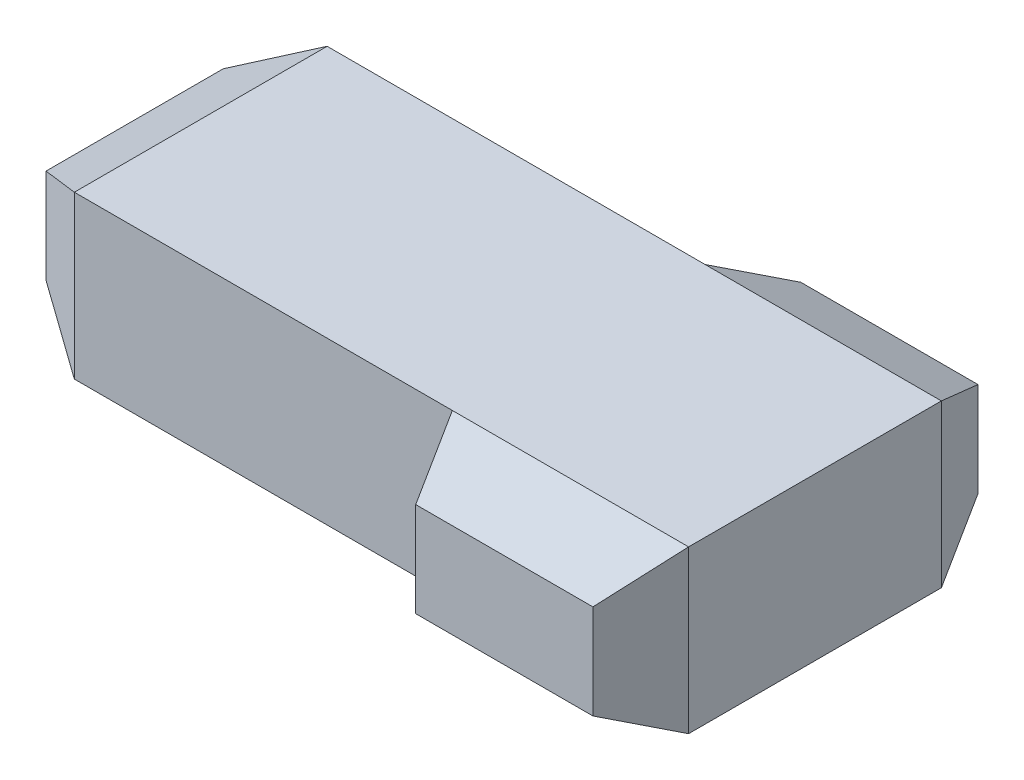
ISO-10303-21;
HEADER;
FILE_DESCRIPTION(('STEP AP214'),'2;1');
FILE_NAME('part.step','',(''),(''),'','','');
FILE_SCHEMA(('AUTOMOTIVE_DESIGN { 1 0 10303 214 1 1 1 1 }'));
ENDSEC;
DATA;
#1=APPLICATION_CONTEXT('core data for automotive mechanical design processes');
#2=APPLICATION_PROTOCOL_DEFINITION('international standard','automotive_design',2000,#1);
#3=PRODUCT_CONTEXT('',#1,'mechanical');
#4=PRODUCT('Part','Part','',(#3));
#5=PRODUCT_RELATED_PRODUCT_CATEGORY('part','',(#4));
#6=PRODUCT_DEFINITION_FORMATION('','',#4);
#7=PRODUCT_DEFINITION_CONTEXT('part definition',#1,'design');
#8=PRODUCT_DEFINITION('design','',#6,#7);
#9=PRODUCT_DEFINITION_SHAPE('','',#8);
#10=(LENGTH_UNIT() NAMED_UNIT(*) SI_UNIT(.MILLI.,.METRE.));
#11=(NAMED_UNIT(*) PLANE_ANGLE_UNIT() SI_UNIT($,.RADIAN.));
#12=(NAMED_UNIT(*) SI_UNIT($,.STERADIAN.) SOLID_ANGLE_UNIT());
#13=UNCERTAINTY_MEASURE_WITH_UNIT(LENGTH_MEASURE(1.E-05),#10,'distance_accuracy_value','');
#14=(GEOMETRIC_REPRESENTATION_CONTEXT(3) GLOBAL_UNCERTAINTY_ASSIGNED_CONTEXT((#13)) GLOBAL_UNIT_ASSIGNED_CONTEXT((#10,
#11,#12)) REPRESENTATION_CONTEXT('',''));
#15=CARTESIAN_POINT('',(0.,0.,0.));
#16=DIRECTION('',(0.,0.,1.));
#17=DIRECTION('',(1.,0.,0.));
#18=AXIS2_PLACEMENT_3D('',#15,#16,#17);
#19=CARTESIAN_POINT('',(13.,6.85,5.35));
#20=DIRECTION('',(0.,0.,-1.));
#21=DIRECTION('',(-1.,0.,0.));
#22=AXIS2_PLACEMENT_3D('',#19,#20,#21);
#23=PLANE('',#22);
#24=DIRECTION('',(1.,0.,0.));
#25=VECTOR('',#24,1.);
#26=CARTESIAN_POINT('',(13.,0.,5.35));
#27=LINE('',#26,#25);
#28=CARTESIAN_POINT('',(-13.,0.,5.35));
#29=VERTEX_POINT('',#28);
#30=CARTESIAN_POINT('',(2.99999999999999,0.,5.35));
#31=VERTEX_POINT('',#30);
#32=EDGE_CURVE('E273',#29,#31,#27,.T.);
#33=ORIENTED_EDGE('',*,*,#32,.T.);
#34=DIRECTION('',(0.,-1.,0.));
#35=VECTOR('',#34,1.);
#36=CARTESIAN_POINT('',(2.99999999999999,6.85,5.35));
#37=LINE('',#36,#35);
#38=CARTESIAN_POINT('',(3.,6.85,5.35));
#39=VERTEX_POINT('',#38);
#40=EDGE_CURVE('E285',#39,#31,#37,.T.);
#41=ORIENTED_EDGE('',*,*,#40,.F.);
#42=DIRECTION('',(1.,0.,0.));
#43=VECTOR('',#42,1.);
#44=CARTESIAN_POINT('',(13.,6.85,5.35));
#45=LINE('',#44,#43);
#46=CARTESIAN_POINT('',(-13.,6.85,5.35));
#47=VERTEX_POINT('',#46);
#48=EDGE_CURVE('E215',#47,#39,#45,.T.);
#49=ORIENTED_EDGE('',*,*,#48,.F.);
#50=DIRECTION('',(0.,1.,0.));
#51=VECTOR('',#50,1.);
#52=CARTESIAN_POINT('',(-13.,6.85,5.35));
#53=LINE('',#52,#51);
#54=EDGE_CURVE('E12',#47,#29,#53,.F.);
#55=ORIENTED_EDGE('',*,*,#54,.T.);
#56=EDGE_LOOP('',(#33,#41,#49,#55));
#57=FACE_BOUND('',#56,.T.);
#58=ADVANCED_FACE('F86',(#57),#23,.F.);
#59=CARTESIAN_POINT('',(13.,6.85,5.35));
#60=DIRECTION('',(-1.,0.,0.));
#61=DIRECTION('',(0.,0.,1.));
#62=AXIS2_PLACEMENT_3D('',#59,#60,#61);
#63=PLANE('',#62);
#64=DIRECTION('',(0.,0.,-1.));
#65=VECTOR('',#64,1.);
#66=CARTESIAN_POINT('',(13.,0.,5.35));
#67=LINE('',#66,#65);
#68=CARTESIAN_POINT('',(13.,0.,5.35));
#69=VERTEX_POINT('',#68);
#70=CARTESIAN_POINT('',(13.,0.,-5.35));
#71=VERTEX_POINT('',#70);
#72=EDGE_CURVE('E220',#69,#71,#67,.T.);
#73=ORIENTED_EDGE('',*,*,#72,.T.);
#74=CARTESIAN_POINT('',(13.,6.85,-5.35));
#75=DIRECTION('',(0.,-1.,0.));
#76=VECTOR('',#75,1.);
#77=LINE('',#74,#76);
#78=CARTESIAN_POINT('',(13.,6.85,-5.35));
#79=VERTEX_POINT('',#78);
#80=EDGE_CURVE('E185',#79,#71,#77,.T.);
#81=ORIENTED_EDGE('',*,*,#80,.F.);
#82=DIRECTION('',(0.,0.,-1.));
#83=VECTOR('',#82,1.);
#84=CARTESIAN_POINT('',(13.,6.85,5.35));
#85=LINE('',#84,#83);
#86=CARTESIAN_POINT('',(13.,6.85,5.35));
#87=VERTEX_POINT('',#86);
#88=EDGE_CURVE('E209',#87,#79,#85,.T.);
#89=ORIENTED_EDGE('',*,*,#88,.F.);
#90=DIRECTION('',(0.,1.,0.));
#91=VECTOR('',#90,1.);
#92=CARTESIAN_POINT('',(13.,6.85,5.35));
#93=LINE('',#92,#91);
#94=EDGE_CURVE('E96',#87,#69,#93,.F.);
#95=ORIENTED_EDGE('',*,*,#94,.T.);
#96=EDGE_LOOP('',(#73,#81,#89,#95));
#97=FACE_BOUND('',#96,.T.);
#98=ADVANCED_FACE('F218',(#97),#63,.F.);
#99=CARTESIAN_POINT('',(13.,6.85,-5.35));
#100=DIRECTION('',(0.,0.,1.));
#101=DIRECTION('',(1.,0.,0.));
#102=AXIS2_PLACEMENT_3D('',#99,#100,#101);
#103=PLANE('',#102);
#104=DIRECTION('',(-1.,0.,0.));
#105=VECTOR('',#104,1.);
#106=CARTESIAN_POINT('',(13.,6.85,-5.35));
#107=LINE('',#106,#105);
#108=CARTESIAN_POINT('',(2.99999999999999,6.85,-5.35));
#109=VERTEX_POINT('',#108);
#110=CARTESIAN_POINT('',(-13.,6.85,-5.35));
#111=VERTEX_POINT('',#110);
#112=EDGE_CURVE('E206',#109,#111,#107,.T.);
#113=ORIENTED_EDGE('',*,*,#112,.F.);
#114=CARTESIAN_POINT('',(2.99999999999999,6.85,-5.35));
#115=DIRECTION('',(0.,-1.,0.));
#116=VECTOR('',#115,1.);
#117=LINE('',#114,#116);
#118=CARTESIAN_POINT('',(3.,0.,-5.35));
#119=VERTEX_POINT('',#118);
#120=EDGE_CURVE('E254',#109,#119,#117,.T.);
#121=ORIENTED_EDGE('',*,*,#120,.T.);
#122=DIRECTION('',(-1.,0.,0.));
#123=VECTOR('',#122,1.);
#124=CARTESIAN_POINT('',(13.,0.,-5.35));
#125=LINE('',#124,#123);
#126=CARTESIAN_POINT('',(-13.,0.,-5.35));
#127=VERTEX_POINT('',#126);
#128=EDGE_CURVE('E258',#119,#127,#125,.T.);
#129=ORIENTED_EDGE('',*,*,#128,.T.);
#130=DIRECTION('',(0.,1.,0.));
#131=VECTOR('',#130,1.);
#132=CARTESIAN_POINT('',(-13.,0.,-5.35));
#133=LINE('',#132,#131);
#134=EDGE_CURVE('E205',#111,#127,#133,.F.);
#135=ORIENTED_EDGE('',*,*,#134,.F.);
#136=EDGE_LOOP('',(#113,#121,#129,#135));
#137=FACE_BOUND('',#136,.T.);
#138=ADVANCED_FACE('F236',(#137),#103,.F.);
#139=CARTESIAN_POINT('',(0.,6.85,0.));
#140=DIRECTION('',(0.,1.,0.));
#141=DIRECTION('',(0.,0.,1.));
#142=AXIS2_PLACEMENT_3D('',#139,#140,#141);
#143=PLANE('',#142);
#144=DIRECTION('',(0.,0.,1.));
#145=VECTOR('',#144,1.);
#146=CARTESIAN_POINT('',(-13.,6.85,0.));
#147=LINE('',#146,#145);
#148=EDGE_CURVE('E272',#111,#47,#147,.T.);
#149=ORIENTED_EDGE('',*,*,#148,.T.);
#150=ORIENTED_EDGE('',*,*,#48,.T.);
#151=DIRECTION('',(-1.,0.,0.));
#152=VECTOR('',#151,1.);
#153=CARTESIAN_POINT('',(13.,6.85,5.35));
#154=LINE('',#153,#152);
#155=EDGE_CURVE('E113',#87,#39,#154,.T.);
#156=ORIENTED_EDGE('',*,*,#155,.F.);
#157=ORIENTED_EDGE('',*,*,#88,.T.);
#158=CARTESIAN_POINT('',(13.,6.85,-5.35));
#159=DIRECTION('',(-1.,0.,0.));
#160=VECTOR('',#159,1.);
#161=LINE('',#158,#160);
#162=EDGE_CURVE('E197',#79,#109,#161,.T.);
#163=ORIENTED_EDGE('',*,*,#162,.T.);
#164=ORIENTED_EDGE('',*,*,#112,.T.);
#165=EDGE_LOOP('',(#149,#150,#156,#157,#163,#164));
#166=FACE_BOUND('',#165,.T.);
#167=ADVANCED_FACE('F211',(#166),#143,.T.);
#168=CARTESIAN_POINT('',(0.,0.,0.));
#169=DIRECTION('',(0.,1.,0.));
#170=DIRECTION('',(0.,0.,1.));
#171=AXIS2_PLACEMENT_3D('',#168,#169,#170);
#172=PLANE('',#171);
#173=DIRECTION('',(0.,0.,1.));
#174=VECTOR('',#173,1.);
#175=CARTESIAN_POINT('',(-13.,0.,0.));
#176=LINE('',#175,#174);
#177=EDGE_CURVE('E456',#127,#29,#176,.T.);
#178=ORIENTED_EDGE('',*,*,#177,.F.);
#179=ORIENTED_EDGE('',*,*,#128,.F.);
#180=CARTESIAN_POINT('',(13.,0.,-5.35));
#181=DIRECTION('',(-1.,0.,0.));
#182=VECTOR('',#181,1.);
#183=LINE('',#180,#182);
#184=EDGE_CURVE('E104',#71,#119,#183,.T.);
#185=ORIENTED_EDGE('',*,*,#184,.F.);
#186=ORIENTED_EDGE('',*,*,#72,.F.);
#187=DIRECTION('',(1.,0.,0.));
#188=VECTOR('',#187,1.);
#189=CARTESIAN_POINT('',(13.,0.,5.35));
#190=LINE('',#189,#188);
#191=EDGE_CURVE('E283',#31,#69,#190,.T.);
#192=ORIENTED_EDGE('',*,*,#191,.F.);
#193=ORIENTED_EDGE('',*,*,#32,.F.);
#194=EDGE_LOOP('',(#178,#179,#185,#186,#192,#193));
#195=FACE_BOUND('',#194,.T.);
#196=ADVANCED_FACE('F240',(#195),#172,.F.);
#197=CARTESIAN_POINT('',(-15.8,0.,0.));
#198=DIRECTION('',(-1.,0.,0.));
#199=DIRECTION('',(0.,0.,1.));
#200=AXIS2_PLACEMENT_3D('',#197,#198,#199);
#201=PLANE('',#200);
#202=DIRECTION('',(0.,-1.,0.));
#203=VECTOR('',#202,1.);
#204=CARTESIAN_POINT('',(-15.8,1.425,-3.75));
#205=LINE('',#204,#203);
#206=CARTESIAN_POINT('',(-15.8,5.425,-3.75));
#207=VERTEX_POINT('',#206);
#208=CARTESIAN_POINT('',(-15.8,1.425,-3.75));
#209=VERTEX_POINT('',#208);
#210=EDGE_CURVE('E433',#207,#209,#205,.T.);
#211=ORIENTED_EDGE('',*,*,#210,.T.);
#212=DIRECTION('',(0.,0.,1.));
#213=VECTOR('',#212,1.);
#214=CARTESIAN_POINT('',(-15.8,1.425,3.75));
#215=LINE('',#214,#213);
#216=CARTESIAN_POINT('',(-15.8,1.425,3.75));
#217=VERTEX_POINT('',#216);
#218=EDGE_CURVE('E476',#209,#217,#215,.T.);
#219=ORIENTED_EDGE('',*,*,#218,.T.);
#220=DIRECTION('',(0.,1.,0.));
#221=VECTOR('',#220,1.);
#222=CARTESIAN_POINT('',(-15.8,1.425,3.75));
#223=LINE('',#222,#221);
#224=CARTESIAN_POINT('',(-15.8,5.425,3.75));
#225=VERTEX_POINT('',#224);
#226=EDGE_CURVE('E483',#217,#225,#223,.T.);
#227=ORIENTED_EDGE('',*,*,#226,.T.);
#228=DIRECTION('',(0.,0.,-1.));
#229=VECTOR('',#228,1.);
#230=CARTESIAN_POINT('',(-15.8,5.425,3.75));
#231=LINE('',#230,#229);
#232=EDGE_CURVE('E490',#225,#207,#231,.T.);
#233=ORIENTED_EDGE('',*,*,#232,.T.);
#234=EDGE_LOOP('',(#211,#219,#227,#233));
#235=FACE_BOUND('',#234,.T.);
#236=ADVANCED_FACE('F488',(#235),#201,.T.);
#237=CARTESIAN_POINT('',(-5.44338631039067,10.6957766098905,0.));
#238=DIRECTION('',(0.453568137065489,-0.891221602654997,0.));
#239=DIRECTION('',(0.891221602654997,0.453568137065489,0.));
#240=AXIS2_PLACEMENT_3D('',#237,#238,#239);
#241=PLANE('',#240);
#242=DIRECTION('',(0.794166473196064,0.40417400868014,0.453809413254894));
#243=VECTOR('',#242,1.);
#244=CARTESIAN_POINT('',(-15.8,5.425,3.75));
#245=LINE('',#244,#243);
#246=EDGE_CURVE('E482',#225,#47,#245,.T.);
#247=ORIENTED_EDGE('',*,*,#246,.T.);
#248=ORIENTED_EDGE('',*,*,#148,.F.);
#249=DIRECTION('',(0.794166473196064,0.40417400868014,-0.453809413254894));
#250=VECTOR('',#249,1.);
#251=CARTESIAN_POINT('',(-15.8,5.425,-3.75));
#252=LINE('',#251,#250);
#253=EDGE_CURVE('E473',#207,#111,#252,.T.);
#254=ORIENTED_EDGE('',*,*,#253,.F.);
#255=ORIENTED_EDGE('',*,*,#232,.F.);
#256=EDGE_LOOP('',(#247,#248,#254,#255));
#257=FACE_BOUND('',#256,.T.);
#258=ADVANCED_FACE('F507',(#257),#241,.F.);
#259=CARTESIAN_POINT('',(-5.50461538461539,0.,-9.63307692307692));
#260=DIRECTION('',(-0.496138938356834,0.,-0.868243142124459));
#261=DIRECTION('',(-0.868243142124459,0.,0.496138938356834));
#262=AXIS2_PLACEMENT_3D('',#259,#260,#261);
#263=PLANE('',#262);
#264=ORIENTED_EDGE('',*,*,#253,.T.);
#265=ORIENTED_EDGE('',*,*,#134,.T.);
#266=DIRECTION('',(0.794166473196064,-0.40417400868014,-0.453809413254894));
#267=VECTOR('',#266,1.);
#268=CARTESIAN_POINT('',(-15.8,1.425,-3.75));
#269=LINE('',#268,#267);
#270=EDGE_CURVE('E457',#209,#127,#269,.T.);
#271=ORIENTED_EDGE('',*,*,#270,.F.);
#272=ORIENTED_EDGE('',*,*,#210,.F.);
#273=EDGE_LOOP('',(#264,#265,#271,#272));
#274=FACE_BOUND('',#273,.T.);
#275=ADVANCED_FACE('F469',(#274),#263,.T.);
#276=CARTESIAN_POINT('',(-5.50461538461539,0.,9.63307692307692));
#277=DIRECTION('',(0.496138938356834,0.,-0.868243142124459));
#278=DIRECTION('',(-0.868243142124459,0.,-0.496138938356834));
#279=AXIS2_PLACEMENT_3D('',#276,#277,#278);
#280=PLANE('',#279);
#281=DIRECTION('',(0.794166473196064,-0.40417400868014,0.453809413254894));
#282=VECTOR('',#281,1.);
#283=CARTESIAN_POINT('',(-15.8,1.425,3.75));
#284=LINE('',#283,#282);
#285=EDGE_CURVE('E462',#217,#29,#284,.T.);
#286=ORIENTED_EDGE('',*,*,#285,.T.);
#287=ORIENTED_EDGE('',*,*,#54,.F.);
#288=ORIENTED_EDGE('',*,*,#246,.F.);
#289=ORIENTED_EDGE('',*,*,#226,.F.);
#290=EDGE_LOOP('',(#286,#287,#288,#289));
#291=FACE_BOUND('',#290,.T.);
#292=ADVANCED_FACE('F541',(#291),#280,.F.);
#293=CARTESIAN_POINT('',(-2.67441271449376,-5.25498638637371,0.));
#294=DIRECTION('',(-0.453568137065489,-0.891221602654997,0.));
#295=DIRECTION('',(0.891221602654997,-0.453568137065489,0.));
#296=AXIS2_PLACEMENT_3D('',#293,#294,#295);
#297=PLANE('',#296);
#298=ORIENTED_EDGE('',*,*,#270,.T.);
#299=ORIENTED_EDGE('',*,*,#177,.T.);
#300=ORIENTED_EDGE('',*,*,#285,.F.);
#301=ORIENTED_EDGE('',*,*,#218,.F.);
#302=EDGE_LOOP('',(#298,#299,#300,#301));
#303=FACE_BOUND('',#302,.T.);
#304=ADVANCED_FACE('F475',(#303),#297,.T.);
#305=CARTESIAN_POINT('',(0.,0.,8.15));
#306=DIRECTION('',(0.,0.,-1.));
#307=DIRECTION('',(-1.,0.,0.));
#308=AXIS2_PLACEMENT_3D('',#305,#306,#307);
#309=PLANE('',#308);
#310=DIRECTION('',(0.,1.,0.));
#311=VECTOR('',#310,1.);
#312=CARTESIAN_POINT('',(11.75,1.425,8.15));
#313=LINE('',#312,#311);
#314=CARTESIAN_POINT('',(11.75,1.425,8.15));
#315=VERTEX_POINT('',#314);
#316=CARTESIAN_POINT('',(11.75,5.425,8.15));
#317=VERTEX_POINT('',#316);
#318=EDGE_CURVE('E418',#315,#317,#313,.T.);
#319=ORIENTED_EDGE('',*,*,#318,.T.);
#320=DIRECTION('',(-1.,0.,0.));
#321=VECTOR('',#320,1.);
#322=CARTESIAN_POINT('',(4.24999999999999,5.425,8.15));
#323=LINE('',#322,#321);
#324=CARTESIAN_POINT('',(4.24999999999999,5.425,8.15));
#325=VERTEX_POINT('',#324);
#326=EDGE_CURVE('E353',#317,#325,#323,.T.);
#327=ORIENTED_EDGE('',*,*,#326,.T.);
#328=DIRECTION('',(0.,-1.,0.));
#329=VECTOR('',#328,1.);
#330=CARTESIAN_POINT('',(4.24999999999999,1.425,8.15));
#331=LINE('',#330,#329);
#332=CARTESIAN_POINT('',(4.24999999999999,1.425,8.15));
#333=VERTEX_POINT('',#332);
#334=EDGE_CURVE('E364',#325,#333,#331,.T.);
#335=ORIENTED_EDGE('',*,*,#334,.T.);
#336=DIRECTION('',(1.,0.,0.));
#337=VECTOR('',#336,1.);
#338=CARTESIAN_POINT('',(4.24999999999999,1.425,8.15));
#339=LINE('',#338,#337);
#340=EDGE_CURVE('E313',#333,#315,#339,.T.);
#341=ORIENTED_EDGE('',*,*,#340,.T.);
#342=EDGE_LOOP('',(#319,#327,#335,#341));
#343=FACE_BOUND('',#342,.T.);
#344=ADVANCED_FACE('F340',(#343),#309,.F.);
#345=CARTESIAN_POINT('',(0.509970752459449,0.,-0.227665514490825));
#346=DIRECTION('',(0.913137882437511,0.,-0.407650840373889));
#347=DIRECTION('',(-0.407650840373889,0.,-0.913137882437511));
#348=AXIS2_PLACEMENT_3D('',#345,#346,#347);
#349=PLANE('',#348);
#350=DIRECTION('',(0.369681346322529,0.421436734807683,0.828086215762466));
#351=VECTOR('',#350,1.);
#352=CARTESIAN_POINT('',(2.99999999999999,0.,5.35));
#353=LINE('',#352,#351);
#354=EDGE_CURVE('E292',#31,#333,#353,.T.);
#355=ORIENTED_EDGE('',*,*,#354,.T.);
#356=ORIENTED_EDGE('',*,*,#334,.F.);
#357=DIRECTION('',(0.369681346322529,-0.421436734807683,0.828086215762466));
#358=VECTOR('',#357,1.);
#359=CARTESIAN_POINT('',(2.99999999999999,6.85,5.35));
#360=LINE('',#359,#358);
#361=EDGE_CURVE('E294',#39,#325,#360,.T.);
#362=ORIENTED_EDGE('',*,*,#361,.F.);
#363=ORIENTED_EDGE('',*,*,#40,.T.);
#364=EDGE_LOOP('',(#355,#356,#362,#363));
#365=FACE_BOUND('',#364,.T.);
#366=ADVANCED_FACE('F370',(#365),#349,.F.);
#367=CARTESIAN_POINT('',(0.,7.60341923637054,3.86959728993858));
#368=DIRECTION('',(0.,-0.891221602654997,-0.453568137065489));
#369=DIRECTION('',(0.,0.453568137065489,-0.891221602654997));
#370=AXIS2_PLACEMENT_3D('',#367,#368,#369);
#371=PLANE('',#370);
#372=ORIENTED_EDGE('',*,*,#361,.T.);
#373=ORIENTED_EDGE('',*,*,#326,.F.);
#374=DIRECTION('',(-0.369681346322529,-0.421436734807683,0.828086215762465));
#375=VECTOR('',#374,1.);
#376=CARTESIAN_POINT('',(13.,6.85,5.35));
#377=LINE('',#376,#375);
#378=EDGE_CURVE('E308',#87,#317,#377,.T.);
#379=ORIENTED_EDGE('',*,*,#378,.F.);
#380=ORIENTED_EDGE('',*,*,#155,.T.);
#381=EDGE_LOOP('',(#372,#373,#379,#380));
#382=FACE_BOUND('',#381,.T.);
#383=ADVANCED_FACE('F332',(#382),#371,.F.);
#384=CARTESIAN_POINT('',(0.,-2.16262901285379,1.10062369404166));
#385=DIRECTION('',(0.,0.891221602654997,-0.453568137065489));
#386=DIRECTION('',(0.,0.453568137065489,0.891221602654997));
#387=AXIS2_PLACEMENT_3D('',#384,#385,#386);
#388=PLANE('',#387);
#389=DIRECTION('',(-0.36968134632253,0.421436734807683,0.828086215762466));
#390=VECTOR('',#389,1.);
#391=CARTESIAN_POINT('',(13.,0.,5.35));
#392=LINE('',#391,#390);
#393=EDGE_CURVE('E299',#69,#315,#392,.T.);
#394=ORIENTED_EDGE('',*,*,#393,.T.);
#395=ORIENTED_EDGE('',*,*,#340,.F.);
#396=ORIENTED_EDGE('',*,*,#354,.F.);
#397=ORIENTED_EDGE('',*,*,#191,.T.);
#398=EDGE_LOOP('',(#394,#395,#396,#397));
#399=FACE_BOUND('',#398,.T.);
#400=ADVANCED_FACE('F321',(#399),#388,.F.);
#401=CARTESIAN_POINT('',(12.8311619250199,0.,5.72819728795533));
#402=DIRECTION('',(-0.913137882437511,0.,-0.407650840373889));
#403=DIRECTION('',(-0.407650840373889,0.,0.913137882437511));
#404=AXIS2_PLACEMENT_3D('',#401,#402,#403);
#405=PLANE('',#404);
#406=ORIENTED_EDGE('',*,*,#378,.T.);
#407=ORIENTED_EDGE('',*,*,#318,.F.);
#408=ORIENTED_EDGE('',*,*,#393,.F.);
#409=ORIENTED_EDGE('',*,*,#94,.F.);
#410=EDGE_LOOP('',(#406,#407,#408,#409));
#411=FACE_BOUND('',#410,.T.);
#412=ADVANCED_FACE('F331',(#411),#405,.F.);
#413=CARTESIAN_POINT('',(0.,0.,-8.15));
#414=DIRECTION('',(0.,0.,1.));
#415=DIRECTION('',(-1.,0.,0.));
#416=AXIS2_PLACEMENT_3D('',#413,#414,#415);
#417=PLANE('',#416);
#418=CARTESIAN_POINT('',(11.75,1.425,-8.15));
#419=DIRECTION('',(0.,1.,0.));
#420=VECTOR('',#419,1.);
#421=LINE('',#418,#420);
#422=CARTESIAN_POINT('',(11.75,1.425,-8.15));
#423=VERTEX_POINT('',#422);
#424=CARTESIAN_POINT('',(11.75,5.425,-8.15));
#425=VERTEX_POINT('',#424);
#426=EDGE_CURVE('E189',#423,#425,#421,.T.);
#427=ORIENTED_EDGE('',*,*,#426,.F.);
#428=CARTESIAN_POINT('',(4.24999999999999,1.425,-8.15));
#429=DIRECTION('',(1.,0.,0.));
#430=VECTOR('',#429,1.);
#431=LINE('',#428,#430);
#432=CARTESIAN_POINT('',(4.24999999999999,1.425,-8.15));
#433=VERTEX_POINT('',#432);
#434=EDGE_CURVE('E286',#433,#423,#431,.T.);
#435=ORIENTED_EDGE('',*,*,#434,.F.);
#436=CARTESIAN_POINT('',(4.24999999999999,5.425,-8.15));
#437=DIRECTION('',(0.,-1.,0.));
#438=VECTOR('',#437,1.);
#439=LINE('',#436,#438);
#440=CARTESIAN_POINT('',(4.24999999999999,5.425,-8.15));
#441=VERTEX_POINT('',#440);
#442=EDGE_CURVE('E757',#441,#433,#439,.T.);
#443=ORIENTED_EDGE('',*,*,#442,.F.);
#444=CARTESIAN_POINT('',(11.75,5.425,-8.15));
#445=DIRECTION('',(-1.,0.,0.));
#446=VECTOR('',#445,1.);
#447=LINE('',#444,#446);
#448=EDGE_CURVE('E745',#425,#441,#447,.T.);
#449=ORIENTED_EDGE('',*,*,#448,.F.);
#450=EDGE_LOOP('',(#427,#435,#443,#449));
#451=FACE_BOUND('',#450,.T.);
#452=ADVANCED_FACE('F338',(#451),#417,.F.);
#453=CARTESIAN_POINT('',(0.509970752459449,0.,0.227665514490825));
#454=DIRECTION('',(0.913137882437511,0.,0.407650840373889));
#455=DIRECTION('',(-0.407650840373889,0.,0.913137882437511));
#456=AXIS2_PLACEMENT_3D('',#453,#454,#455);
#457=PLANE('',#456);
#458=DIRECTION('',(0.369681346322529,0.421436734807683,-0.828086215762466));
#459=VECTOR('',#458,1.);
#460=CARTESIAN_POINT('',(2.99999999999999,0.,-5.35));
#461=LINE('',#460,#459);
#462=EDGE_CURVE('E773',#119,#433,#461,.T.);
#463=ORIENTED_EDGE('',*,*,#462,.F.);
#464=ORIENTED_EDGE('',*,*,#120,.F.);
#465=DIRECTION('',(0.369681346322529,-0.421436734807683,-0.828086215762466));
#466=VECTOR('',#465,1.);
#467=CARTESIAN_POINT('',(2.99999999999999,6.85,-5.35));
#468=LINE('',#467,#466);
#469=EDGE_CURVE('E201',#109,#441,#468,.T.);
#470=ORIENTED_EDGE('',*,*,#469,.T.);
#471=ORIENTED_EDGE('',*,*,#442,.T.);
#472=EDGE_LOOP('',(#463,#464,#470,#471));
#473=FACE_BOUND('',#472,.T.);
#474=ADVANCED_FACE('F382',(#473),#457,.F.);
#475=CARTESIAN_POINT('',(0.,7.60341923637054,-3.86959728993858));
#476=DIRECTION('',(0.,-0.891221602654997,0.453568137065489));
#477=DIRECTION('',(0.,0.453568137065489,0.891221602654997));
#478=AXIS2_PLACEMENT_3D('',#475,#476,#477);
#479=PLANE('',#478);
#480=ORIENTED_EDGE('',*,*,#469,.F.);
#481=ORIENTED_EDGE('',*,*,#162,.F.);
#482=DIRECTION('',(-0.369681346322529,-0.421436734807683,-0.828086215762465));
#483=VECTOR('',#482,1.);
#484=CARTESIAN_POINT('',(13.,6.85,-5.35));
#485=LINE('',#484,#483);
#486=EDGE_CURVE('E181',#79,#425,#485,.T.);
#487=ORIENTED_EDGE('',*,*,#486,.T.);
#488=ORIENTED_EDGE('',*,*,#448,.T.);
#489=EDGE_LOOP('',(#480,#481,#487,#488));
#490=FACE_BOUND('',#489,.T.);
#491=ADVANCED_FACE('F200',(#490),#479,.F.);
#492=CARTESIAN_POINT('',(0.,-2.16262901285379,-1.10062369404166));
#493=DIRECTION('',(0.,0.891221602654997,0.453568137065489));
#494=DIRECTION('',(0.,0.453568137065489,-0.891221602654997));
#495=AXIS2_PLACEMENT_3D('',#492,#493,#494);
#496=PLANE('',#495);
#497=DIRECTION('',(-0.36968134632253,0.421436734807683,-0.828086215762466));
#498=VECTOR('',#497,1.);
#499=CARTESIAN_POINT('',(13.,0.,-5.35));
#500=LINE('',#499,#498);
#501=EDGE_CURVE('E194',#71,#423,#500,.T.);
#502=ORIENTED_EDGE('',*,*,#501,.F.);
#503=ORIENTED_EDGE('',*,*,#184,.T.);
#504=ORIENTED_EDGE('',*,*,#462,.T.);
#505=ORIENTED_EDGE('',*,*,#434,.T.);
#506=EDGE_LOOP('',(#502,#503,#504,#505));
#507=FACE_BOUND('',#506,.T.);
#508=ADVANCED_FACE('F684',(#507),#496,.F.);
#509=CARTESIAN_POINT('',(12.8311619250199,0.,-5.72819728795533));
#510=DIRECTION('',(-0.913137882437511,0.,0.407650840373889));
#511=DIRECTION('',(-0.407650840373889,0.,-0.913137882437511));
#512=AXIS2_PLACEMENT_3D('',#509,#510,#511);
#513=PLANE('',#512);
#514=ORIENTED_EDGE('',*,*,#486,.F.);
#515=ORIENTED_EDGE('',*,*,#80,.T.);
#516=ORIENTED_EDGE('',*,*,#501,.T.);
#517=ORIENTED_EDGE('',*,*,#426,.T.);
#518=EDGE_LOOP('',(#514,#515,#516,#517));
#519=FACE_BOUND('',#518,.T.);
#520=ADVANCED_FACE('F183',(#519),#513,.F.);
#521=CLOSED_SHELL('',(#58,#98,#138,#167,#196,#236,#258,#275,#292,#304,#344,#366,#383,#400,#412,
#452,#474,#491,#508,#520));
#522=MANIFOLD_SOLID_BREP('B2',#521);
#523=ADVANCED_BREP_SHAPE_REPRESENTATION('',(#18,#522),#14);
#524=SHAPE_DEFINITION_REPRESENTATION(#9,#523);
ENDSEC;
END-ISO-10303-21;
